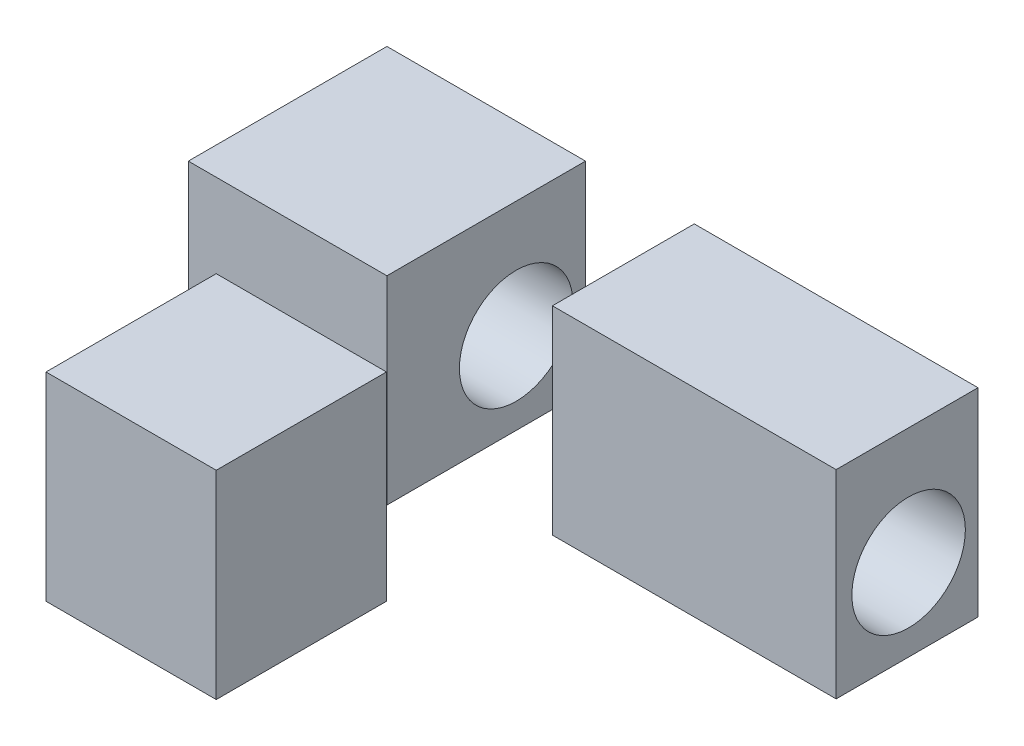
ISO-10303-21;
HEADER;
FILE_DESCRIPTION(('STEP AP214'),'2;1');
FILE_NAME('part.step','',(''),(''),'','','');
FILE_SCHEMA(('AUTOMOTIVE_DESIGN { 1 0 10303 214 1 1 1 1 }'));
ENDSEC;
DATA;
#1=APPLICATION_CONTEXT('core data for automotive mechanical design processes');
#2=APPLICATION_PROTOCOL_DEFINITION('international standard','automotive_design',2000,#1);
#3=PRODUCT_CONTEXT('',#1,'mechanical');
#4=PRODUCT('Part','Part','',(#3));
#5=PRODUCT_RELATED_PRODUCT_CATEGORY('part','',(#4));
#6=PRODUCT_DEFINITION_FORMATION('','',#4);
#7=PRODUCT_DEFINITION_CONTEXT('part definition',#1,'design');
#8=PRODUCT_DEFINITION('design','',#6,#7);
#9=PRODUCT_DEFINITION_SHAPE('','',#8);
#10=(LENGTH_UNIT() NAMED_UNIT(*) SI_UNIT(.MILLI.,.METRE.));
#11=(NAMED_UNIT(*) PLANE_ANGLE_UNIT() SI_UNIT($,.RADIAN.));
#12=(NAMED_UNIT(*) SI_UNIT($,.STERADIAN.) SOLID_ANGLE_UNIT());
#13=UNCERTAINTY_MEASURE_WITH_UNIT(LENGTH_MEASURE(1.E-05),#10,'distance_accuracy_value','');
#14=(GEOMETRIC_REPRESENTATION_CONTEXT(3) GLOBAL_UNCERTAINTY_ASSIGNED_CONTEXT((#13)) GLOBAL_UNIT_ASSIGNED_CONTEXT((#10,
#11,#12)) REPRESENTATION_CONTEXT('',''));
#15=CARTESIAN_POINT('',(0.,0.,0.));
#16=DIRECTION('',(0.,0.,1.));
#17=DIRECTION('',(1.,0.,0.));
#18=AXIS2_PLACEMENT_3D('',#15,#16,#17);
#19=CARTESIAN_POINT('',(-49.5238095238095,70.,60.2742857142857));
#20=DIRECTION('',(1.,0.,0.));
#21=DIRECTION('',(0.,0.,-1.));
#22=AXIS2_PLACEMENT_3D('',#19,#20,#21);
#23=PLANE('',#22);
#24=DIRECTION('',(0.,0.,1.));
#25=VECTOR('',#24,1.);
#26=CARTESIAN_POINT('',(-49.5238095238095,0.,60.2742857142857));
#27=LINE('',#26,#25);
#28=CARTESIAN_POINT('',(-49.5238095238095,0.,60.2742857142857));
#29=VERTEX_POINT('',#28);
#30=CARTESIAN_POINT('',(-49.5238095238095,0.,120.274285714286));
#31=VERTEX_POINT('',#30);
#32=EDGE_CURVE('E107',#29,#31,#27,.T.);
#33=ORIENTED_EDGE('',*,*,#32,.T.);
#34=DIRECTION('',(0.,-1.,0.));
#35=VECTOR('',#34,1.);
#36=CARTESIAN_POINT('',(-49.5238095238095,70.,120.274285714286));
#37=LINE('',#36,#35);
#38=CARTESIAN_POINT('',(-49.5238095238095,70.,120.274285714286));
#39=VERTEX_POINT('',#38);
#40=EDGE_CURVE('E12',#39,#31,#37,.T.);
#41=ORIENTED_EDGE('',*,*,#40,.F.);
#42=DIRECTION('',(0.,0.,1.));
#43=VECTOR('',#42,1.);
#44=CARTESIAN_POINT('',(-49.5238095238095,70.,60.2742857142857));
#45=LINE('',#44,#43);
#46=CARTESIAN_POINT('',(-49.5238095238095,70.,60.2742857142857));
#47=VERTEX_POINT('',#46);
#48=EDGE_CURVE('E95',#47,#39,#45,.T.);
#49=ORIENTED_EDGE('',*,*,#48,.F.);
#50=DIRECTION('',(0.,-1.,0.));
#51=VECTOR('',#50,1.);
#52=CARTESIAN_POINT('',(-49.5238095238095,70.,60.2742857142857));
#53=LINE('',#52,#51);
#54=EDGE_CURVE('E103',#47,#29,#53,.T.);
#55=ORIENTED_EDGE('',*,*,#54,.T.);
#56=EDGE_LOOP('',(#33,#41,#49,#55));
#57=FACE_BOUND('',#56,.T.);
#58=ADVANCED_FACE('F44',(#57),#23,.F.);
#59=CARTESIAN_POINT('',(-49.5238095238095,70.,120.274285714286));
#60=DIRECTION('',(0.,0.,-1.));
#61=DIRECTION('',(-1.,0.,0.));
#62=AXIS2_PLACEMENT_3D('',#59,#60,#61);
#63=PLANE('',#62);
#64=DIRECTION('',(1.,0.,0.));
#65=VECTOR('',#64,1.);
#66=CARTESIAN_POINT('',(-49.5238095238095,0.,120.274285714286));
#67=LINE('',#66,#65);
#68=CARTESIAN_POINT('',(10.4761904761905,0.,120.274285714286));
#69=VERTEX_POINT('',#68);
#70=EDGE_CURVE('E99',#31,#69,#67,.T.);
#71=ORIENTED_EDGE('',*,*,#70,.T.);
#72=DIRECTION('',(0.,-1.,0.));
#73=VECTOR('',#72,1.);
#74=CARTESIAN_POINT('',(10.4761904761905,70.,120.274285714286));
#75=LINE('',#74,#73);
#76=CARTESIAN_POINT('',(10.4761904761905,70.,120.274285714286));
#77=VERTEX_POINT('',#76);
#78=EDGE_CURVE('E52',#77,#69,#75,.T.);
#79=ORIENTED_EDGE('',*,*,#78,.F.);
#80=DIRECTION('',(1.,0.,0.));
#81=VECTOR('',#80,1.);
#82=CARTESIAN_POINT('',(-49.5238095238095,70.,120.274285714286));
#83=LINE('',#82,#81);
#84=EDGE_CURVE('E90',#39,#77,#83,.T.);
#85=ORIENTED_EDGE('',*,*,#84,.F.);
#86=ORIENTED_EDGE('',*,*,#40,.T.);
#87=EDGE_LOOP('',(#71,#79,#85,#86));
#88=FACE_BOUND('',#87,.T.);
#89=ADVANCED_FACE('F98',(#88),#63,.F.);
#90=CARTESIAN_POINT('',(10.4761904761905,70.,60.2742857142857));
#91=DIRECTION('',(-1.,0.,0.));
#92=DIRECTION('',(0.,0.,1.));
#93=AXIS2_PLACEMENT_3D('',#90,#91,#92);
#94=PLANE('',#93);
#95=DIRECTION('',(0.,0.,-1.));
#96=VECTOR('',#95,1.);
#97=CARTESIAN_POINT('',(10.4761904761905,0.,60.2742857142857));
#98=LINE('',#97,#96);
#99=CARTESIAN_POINT('',(10.4761904761905,0.,60.2742857142857));
#100=VERTEX_POINT('',#99);
#101=EDGE_CURVE('E77',#69,#100,#98,.T.);
#102=ORIENTED_EDGE('',*,*,#101,.T.);
#103=DIRECTION('',(0.,-1.,0.));
#104=VECTOR('',#103,1.);
#105=CARTESIAN_POINT('',(10.4761904761905,70.,60.2742857142857));
#106=LINE('',#105,#104);
#107=CARTESIAN_POINT('',(10.4761904761905,70.,60.2742857142857));
#108=VERTEX_POINT('',#107);
#109=EDGE_CURVE('E100',#108,#100,#106,.T.);
#110=ORIENTED_EDGE('',*,*,#109,.F.);
#111=DIRECTION('',(0.,0.,-1.));
#112=VECTOR('',#111,1.);
#113=CARTESIAN_POINT('',(10.4761904761905,70.,60.2742857142857));
#114=LINE('',#113,#112);
#115=EDGE_CURVE('E93',#77,#108,#114,.T.);
#116=ORIENTED_EDGE('',*,*,#115,.F.);
#117=ORIENTED_EDGE('',*,*,#78,.T.);
#118=EDGE_LOOP('',(#102,#110,#116,#117));
#119=FACE_BOUND('',#118,.T.);
#120=ADVANCED_FACE('F101',(#119),#94,.F.);
#121=CARTESIAN_POINT('',(-49.5238095238095,70.,60.2742857142857));
#122=DIRECTION('',(0.,0.,1.));
#123=DIRECTION('',(1.,0.,0.));
#124=AXIS2_PLACEMENT_3D('',#121,#122,#123);
#125=PLANE('',#124);
#126=DIRECTION('',(-1.,0.,0.));
#127=VECTOR('',#126,1.);
#128=CARTESIAN_POINT('',(-49.5238095238095,0.,60.2742857142857));
#129=LINE('',#128,#127);
#130=EDGE_CURVE('E83',#100,#29,#129,.T.);
#131=ORIENTED_EDGE('',*,*,#130,.T.);
#132=ORIENTED_EDGE('',*,*,#54,.F.);
#133=DIRECTION('',(-1.,0.,0.));
#134=VECTOR('',#133,1.);
#135=CARTESIAN_POINT('',(-49.5238095238095,70.,60.2742857142857));
#136=LINE('',#135,#134);
#137=EDGE_CURVE('E60',#108,#47,#136,.T.);
#138=ORIENTED_EDGE('',*,*,#137,.F.);
#139=ORIENTED_EDGE('',*,*,#109,.T.);
#140=EDGE_LOOP('',(#131,#132,#138,#139));
#141=FACE_BOUND('',#140,.T.);
#142=ADVANCED_FACE('F114',(#141),#125,.F.);
#143=CARTESIAN_POINT('',(0.,70.,0.));
#144=DIRECTION('',(0.,1.,0.));
#145=DIRECTION('',(0.,0.,1.));
#146=AXIS2_PLACEMENT_3D('',#143,#144,#145);
#147=PLANE('',#146);
#148=ORIENTED_EDGE('',*,*,#48,.T.);
#149=ORIENTED_EDGE('',*,*,#84,.T.);
#150=ORIENTED_EDGE('',*,*,#115,.T.);
#151=ORIENTED_EDGE('',*,*,#137,.T.);
#152=EDGE_LOOP('',(#148,#149,#150,#151));
#153=FACE_BOUND('',#152,.T.);
#154=ADVANCED_FACE('F91',(#153),#147,.T.);
#155=CARTESIAN_POINT('',(0.,0.,0.));
#156=DIRECTION('',(0.,1.,0.));
#157=DIRECTION('',(0.,0.,1.));
#158=AXIS2_PLACEMENT_3D('',#155,#156,#157);
#159=PLANE('',#158);
#160=ORIENTED_EDGE('',*,*,#32,.F.);
#161=ORIENTED_EDGE('',*,*,#130,.F.);
#162=ORIENTED_EDGE('',*,*,#101,.F.);
#163=ORIENTED_EDGE('',*,*,#70,.F.);
#164=EDGE_LOOP('',(#160,#161,#162,#163));
#165=FACE_BOUND('',#164,.T.);
#166=ADVANCED_FACE('F117',(#165),#159,.F.);
#167=CLOSED_SHELL('',(#58,#89,#120,#142,#154,#166));
#168=MANIFOLD_SOLID_BREP('B2',#167);
#169=CARTESIAN_POINT('',(19.5238095238095,70.,-39.1666666666667));
#170=DIRECTION('',(1.,0.,0.));
#171=DIRECTION('',(0.,0.,-1.));
#172=AXIS2_PLACEMENT_3D('',#169,#170,#171);
#173=PLANE('',#172);
#174=CARTESIAN_POINT('',(19.5238095238095,28.9023299440304,-14.714433962219));
#175=DIRECTION('',(1.,0.,0.));
#176=DIRECTION('',(0.,0.,-1.));
#177=AXIS2_PLACEMENT_3D('',#174,#175,#176);
#178=CIRCLE('',#177,20.);
#179=CARTESIAN_POINT('',(19.5238095238095,28.9023299440304,-34.714433962219));
#180=VERTEX_POINT('',#179);
#181=EDGE_CURVE('E243',#180,#180,#178,.T.);
#182=ORIENTED_EDGE('',*,*,#181,.T.);
#183=EDGE_LOOP('',(#182));
#184=FACE_BOUND('',#183,.T.);
#185=DIRECTION('',(0.,0.,1.));
#186=VECTOR('',#185,1.);
#187=CARTESIAN_POINT('',(19.5238095238095,0.,-39.1666666666667));
#188=LINE('',#187,#186);
#189=CARTESIAN_POINT('',(19.5238095238095,0.,-39.1666666666667));
#190=VERTEX_POINT('',#189);
#191=CARTESIAN_POINT('',(19.5238095238095,0.,10.8333333333333));
#192=VERTEX_POINT('',#191);
#193=EDGE_CURVE('E240',#190,#192,#188,.T.);
#194=ORIENTED_EDGE('',*,*,#193,.T.);
#195=DIRECTION('',(0.,-1.,0.));
#196=VECTOR('',#195,1.);
#197=CARTESIAN_POINT('',(19.5238095238095,70.,10.8333333333333));
#198=LINE('',#197,#196);
#199=CARTESIAN_POINT('',(19.5238095238095,70.,10.8333333333333));
#200=VERTEX_POINT('',#199);
#201=EDGE_CURVE('E42',#200,#192,#198,.T.);
#202=ORIENTED_EDGE('',*,*,#201,.F.);
#203=DIRECTION('',(0.,0.,1.));
#204=VECTOR('',#203,1.);
#205=CARTESIAN_POINT('',(19.5238095238095,70.,-39.1666666666667));
#206=LINE('',#205,#204);
#207=CARTESIAN_POINT('',(19.5238095238095,70.,-39.1666666666667));
#208=VERTEX_POINT('',#207);
#209=EDGE_CURVE('E228',#208,#200,#206,.T.);
#210=ORIENTED_EDGE('',*,*,#209,.F.);
#211=DIRECTION('',(0.,-1.,0.));
#212=VECTOR('',#211,1.);
#213=CARTESIAN_POINT('',(19.5238095238095,70.,-39.1666666666667));
#214=LINE('',#213,#212);
#215=EDGE_CURVE('E236',#208,#190,#214,.T.);
#216=ORIENTED_EDGE('',*,*,#215,.T.);
#217=EDGE_LOOP('',(#194,#202,#210,#216));
#218=FACE_BOUND('',#217,.T.);
#219=ADVANCED_FACE('F177',(#184,#218),#173,.F.);
#220=CARTESIAN_POINT('',(19.5238095238095,70.,10.8333333333333));
#221=DIRECTION('',(0.,0.,-1.));
#222=DIRECTION('',(-1.,0.,0.));
#223=AXIS2_PLACEMENT_3D('',#220,#221,#222);
#224=PLANE('',#223);
#225=DIRECTION('',(1.,0.,0.));
#226=VECTOR('',#225,1.);
#227=CARTESIAN_POINT('',(19.5238095238095,0.,10.8333333333333));
#228=LINE('',#227,#226);
#229=CARTESIAN_POINT('',(119.52380952381,0.,10.8333333333333));
#230=VERTEX_POINT('',#229);
#231=EDGE_CURVE('E232',#192,#230,#228,.T.);
#232=ORIENTED_EDGE('',*,*,#231,.T.);
#233=DIRECTION('',(0.,-1.,0.));
#234=VECTOR('',#233,1.);
#235=CARTESIAN_POINT('',(119.52380952381,70.,10.8333333333333));
#236=LINE('',#235,#234);
#237=CARTESIAN_POINT('',(119.52380952381,70.,10.8333333333333));
#238=VERTEX_POINT('',#237);
#239=EDGE_CURVE('E185',#238,#230,#236,.T.);
#240=ORIENTED_EDGE('',*,*,#239,.F.);
#241=DIRECTION('',(1.,0.,0.));
#242=VECTOR('',#241,1.);
#243=CARTESIAN_POINT('',(19.5238095238095,70.,10.8333333333333));
#244=LINE('',#243,#242);
#245=EDGE_CURVE('E223',#200,#238,#244,.T.);
#246=ORIENTED_EDGE('',*,*,#245,.F.);
#247=ORIENTED_EDGE('',*,*,#201,.T.);
#248=EDGE_LOOP('',(#232,#240,#246,#247));
#249=FACE_BOUND('',#248,.T.);
#250=ADVANCED_FACE('F231',(#249),#224,.F.);
#251=CARTESIAN_POINT('',(119.52380952381,70.,-39.1666666666667));
#252=DIRECTION('',(-1.,0.,0.));
#253=DIRECTION('',(0.,0.,1.));
#254=AXIS2_PLACEMENT_3D('',#251,#252,#253);
#255=PLANE('',#254);
#256=CARTESIAN_POINT('',(119.52380952381,28.9023299440304,-14.714433962219));
#257=DIRECTION('',(1.,0.,0.));
#258=DIRECTION('',(0.,0.,-1.));
#259=AXIS2_PLACEMENT_3D('',#256,#257,#258);
#260=CIRCLE('',#259,20.);
#261=CARTESIAN_POINT('',(119.52380952381,28.9023299440304,-34.714433962219));
#262=VERTEX_POINT('',#261);
#263=EDGE_CURVE('E256',#262,#262,#260,.T.);
#264=ORIENTED_EDGE('',*,*,#263,.F.);
#265=EDGE_LOOP('',(#264));
#266=FACE_BOUND('',#265,.T.);
#267=DIRECTION('',(0.,0.,-1.));
#268=VECTOR('',#267,1.);
#269=CARTESIAN_POINT('',(119.52380952381,0.,-39.1666666666667));
#270=LINE('',#269,#268);
#271=CARTESIAN_POINT('',(119.52380952381,0.,-39.1666666666667));
#272=VERTEX_POINT('',#271);
#273=EDGE_CURVE('E210',#230,#272,#270,.T.);
#274=ORIENTED_EDGE('',*,*,#273,.T.);
#275=DIRECTION('',(0.,-1.,0.));
#276=VECTOR('',#275,1.);
#277=CARTESIAN_POINT('',(119.52380952381,70.,-39.1666666666667));
#278=LINE('',#277,#276);
#279=CARTESIAN_POINT('',(119.52380952381,70.,-39.1666666666667));
#280=VERTEX_POINT('',#279);
#281=EDGE_CURVE('E233',#280,#272,#278,.T.);
#282=ORIENTED_EDGE('',*,*,#281,.F.);
#283=DIRECTION('',(0.,0.,-1.));
#284=VECTOR('',#283,1.);
#285=CARTESIAN_POINT('',(119.52380952381,70.,-39.1666666666667));
#286=LINE('',#285,#284);
#287=EDGE_CURVE('E226',#238,#280,#286,.T.);
#288=ORIENTED_EDGE('',*,*,#287,.F.);
#289=ORIENTED_EDGE('',*,*,#239,.T.);
#290=EDGE_LOOP('',(#274,#282,#288,#289));
#291=FACE_BOUND('',#290,.T.);
#292=ADVANCED_FACE('F234',(#266,#291),#255,.F.);
#293=CARTESIAN_POINT('',(19.5238095238095,70.,-39.1666666666667));
#294=DIRECTION('',(0.,0.,1.));
#295=DIRECTION('',(1.,0.,0.));
#296=AXIS2_PLACEMENT_3D('',#293,#294,#295);
#297=PLANE('',#296);
#298=DIRECTION('',(-1.,0.,0.));
#299=VECTOR('',#298,1.);
#300=CARTESIAN_POINT('',(19.5238095238095,0.,-39.1666666666667));
#301=LINE('',#300,#299);
#302=EDGE_CURVE('E216',#272,#190,#301,.T.);
#303=ORIENTED_EDGE('',*,*,#302,.T.);
#304=ORIENTED_EDGE('',*,*,#215,.F.);
#305=DIRECTION('',(-1.,0.,0.));
#306=VECTOR('',#305,1.);
#307=CARTESIAN_POINT('',(19.5238095238095,70.,-39.1666666666667));
#308=LINE('',#307,#306);
#309=EDGE_CURVE('E193',#280,#208,#308,.T.);
#310=ORIENTED_EDGE('',*,*,#309,.F.);
#311=ORIENTED_EDGE('',*,*,#281,.T.);
#312=EDGE_LOOP('',(#303,#304,#310,#311));
#313=FACE_BOUND('',#312,.T.);
#314=ADVANCED_FACE('F248',(#313),#297,.F.);
#315=CARTESIAN_POINT('',(0.,70.,0.));
#316=DIRECTION('',(0.,1.,0.));
#317=DIRECTION('',(0.,0.,1.));
#318=AXIS2_PLACEMENT_3D('',#315,#316,#317);
#319=PLANE('',#318);
#320=ORIENTED_EDGE('',*,*,#209,.T.);
#321=ORIENTED_EDGE('',*,*,#245,.T.);
#322=ORIENTED_EDGE('',*,*,#287,.T.);
#323=ORIENTED_EDGE('',*,*,#309,.T.);
#324=EDGE_LOOP('',(#320,#321,#322,#323));
#325=FACE_BOUND('',#324,.T.);
#326=ADVANCED_FACE('F224',(#325),#319,.T.);
#327=CARTESIAN_POINT('',(0.,0.,0.));
#328=DIRECTION('',(0.,1.,0.));
#329=DIRECTION('',(0.,0.,1.));
#330=AXIS2_PLACEMENT_3D('',#327,#328,#329);
#331=PLANE('',#330);
#332=ORIENTED_EDGE('',*,*,#193,.F.);
#333=ORIENTED_EDGE('',*,*,#302,.F.);
#334=ORIENTED_EDGE('',*,*,#273,.F.);
#335=ORIENTED_EDGE('',*,*,#231,.F.);
#336=EDGE_LOOP('',(#332,#333,#334,#335));
#337=FACE_BOUND('',#336,.T.);
#338=ADVANCED_FACE('F251',(#337),#331,.F.);
#339=CARTESIAN_POINT('',(-88.8095238095239,28.9023299440304,-14.714433962219));
#340=DIRECTION('',(1.,0.,0.));
#341=DIRECTION('',(0.,0.,-1.));
#342=AXIS2_PLACEMENT_3D('',#339,#340,#341);
#343=CYLINDRICAL_SURFACE('',#342,20.);
#344=ORIENTED_EDGE('',*,*,#263,.T.);
#345=EDGE_LOOP('',(#344));
#346=FACE_BOUND('',#345,.T.);
#347=ORIENTED_EDGE('',*,*,#181,.F.);
#348=EDGE_LOOP('',(#347));
#349=FACE_BOUND('',#348,.T.);
#350=ADVANCED_FACE('F260',(#346,#349),#343,.F.);
#351=CLOSED_SHELL('',(#219,#250,#292,#314,#326,#338,#350));
#352=MANIFOLD_SOLID_BREP('B6',#351);
#353=CARTESIAN_POINT('',(-88.8095238095238,70.,-39.1666666666667));
#354=DIRECTION('',(1.,0.,0.));
#355=DIRECTION('',(0.,0.,-1.));
#356=AXIS2_PLACEMENT_3D('',#353,#354,#355);
#357=PLANE('',#356);
#358=CARTESIAN_POINT('',(-88.8095238095239,28.9023299440304,-14.714433962219));
#359=DIRECTION('',(1.,0.,0.));
#360=DIRECTION('',(0.,0.,-1.));
#361=AXIS2_PLACEMENT_3D('',#358,#359,#360);
#362=CIRCLE('',#361,20.);
#363=CARTESIAN_POINT('',(-88.8095238095239,28.9023299440304,-34.714433962219));
#364=VERTEX_POINT('',#363);
#365=EDGE_CURVE('E400',#364,#364,#362,.T.);
#366=ORIENTED_EDGE('',*,*,#365,.T.);
#367=EDGE_LOOP('',(#366));
#368=FACE_BOUND('',#367,.T.);
#369=DIRECTION('',(0.,0.,1.));
#370=VECTOR('',#369,1.);
#371=CARTESIAN_POINT('',(-88.8095238095238,0.,-39.1666666666667));
#372=LINE('',#371,#370);
#373=CARTESIAN_POINT('',(-88.8095238095238,0.,-39.1666666666667));
#374=VERTEX_POINT('',#373);
#375=CARTESIAN_POINT('',(-88.8095238095238,0.,30.8333333333333));
#376=VERTEX_POINT('',#375);
#377=EDGE_CURVE('E387',#374,#376,#372,.T.);
#378=ORIENTED_EDGE('',*,*,#377,.T.);
#379=DIRECTION('',(0.,-1.,0.));
#380=VECTOR('',#379,1.);
#381=CARTESIAN_POINT('',(-88.8095238095238,70.,30.8333333333333));
#382=LINE('',#381,#380);
#383=CARTESIAN_POINT('',(-88.8095238095238,70.,30.8333333333333));
#384=VERTEX_POINT('',#383);
#385=EDGE_CURVE('E175',#384,#376,#382,.T.);
#386=ORIENTED_EDGE('',*,*,#385,.F.);
#387=DIRECTION('',(0.,0.,1.));
#388=VECTOR('',#387,1.);
#389=CARTESIAN_POINT('',(-88.8095238095238,70.,-39.1666666666667));
#390=LINE('',#389,#388);
#391=CARTESIAN_POINT('',(-88.8095238095238,70.,-39.1666666666667));
#392=VERTEX_POINT('',#391);
#393=EDGE_CURVE('E374',#392,#384,#390,.T.);
#394=ORIENTED_EDGE('',*,*,#393,.F.);
#395=DIRECTION('',(0.,-1.,0.));
#396=VECTOR('',#395,1.);
#397=CARTESIAN_POINT('',(-88.8095238095238,70.,-39.1666666666667));
#398=LINE('',#397,#396);
#399=EDGE_CURVE('E383',#392,#374,#398,.T.);
#400=ORIENTED_EDGE('',*,*,#399,.T.);
#401=EDGE_LOOP('',(#378,#386,#394,#400));
#402=FACE_BOUND('',#401,.T.);
#403=ADVANCED_FACE('F322',(#368,#402),#357,.F.);
#404=CARTESIAN_POINT('',(-88.8095238095238,70.,30.8333333333333));
#405=DIRECTION('',(0.,0.,-1.));
#406=DIRECTION('',(-1.,0.,0.));
#407=AXIS2_PLACEMENT_3D('',#404,#405,#406);
#408=PLANE('',#407);
#409=DIRECTION('',(1.,0.,0.));
#410=VECTOR('',#409,1.);
#411=CARTESIAN_POINT('',(-88.8095238095238,0.,30.8333333333333));
#412=LINE('',#411,#410);
#413=CARTESIAN_POINT('',(-18.8095238095238,0.,30.8333333333333));
#414=VERTEX_POINT('',#413);
#415=EDGE_CURVE('E378',#376,#414,#412,.T.);
#416=ORIENTED_EDGE('',*,*,#415,.T.);
#417=DIRECTION('',(0.,-1.,0.));
#418=VECTOR('',#417,1.);
#419=CARTESIAN_POINT('',(-18.8095238095238,70.,30.8333333333333));
#420=LINE('',#419,#418);
#421=CARTESIAN_POINT('',(-18.8095238095238,70.,30.8333333333333));
#422=VERTEX_POINT('',#421);
#423=EDGE_CURVE('E331',#422,#414,#420,.T.);
#424=ORIENTED_EDGE('',*,*,#423,.F.);
#425=DIRECTION('',(1.,0.,0.));
#426=VECTOR('',#425,1.);
#427=CARTESIAN_POINT('',(-88.8095238095238,70.,30.8333333333333));
#428=LINE('',#427,#426);
#429=EDGE_CURVE('E369',#384,#422,#428,.T.);
#430=ORIENTED_EDGE('',*,*,#429,.F.);
#431=ORIENTED_EDGE('',*,*,#385,.T.);
#432=EDGE_LOOP('',(#416,#424,#430,#431));
#433=FACE_BOUND('',#432,.T.);
#434=ADVANCED_FACE('F377',(#433),#408,.F.);
#435=CARTESIAN_POINT('',(-18.8095238095238,70.,-39.1666666666667));
#436=DIRECTION('',(-1.,0.,0.));
#437=DIRECTION('',(0.,0.,1.));
#438=AXIS2_PLACEMENT_3D('',#435,#436,#437);
#439=PLANE('',#438);
#440=CARTESIAN_POINT('',(-18.8095238095238,28.9023299440304,-14.714433962219));
#441=DIRECTION('',(-1.,0.,0.));
#442=DIRECTION('',(0.,0.,1.));
#443=AXIS2_PLACEMENT_3D('',#440,#441,#442);
#444=CIRCLE('',#443,20.);
#445=CARTESIAN_POINT('',(-18.8095238095238,28.9023299440304,5.28556603778102));
#446=VERTEX_POINT('',#445);
#447=EDGE_CURVE('E325',#446,#446,#444,.T.);
#448=ORIENTED_EDGE('',*,*,#447,.T.);
#449=EDGE_LOOP('',(#448));
#450=FACE_BOUND('',#449,.T.);
#451=DIRECTION('',(0.,0.,-1.));
#452=VECTOR('',#451,1.);
#453=CARTESIAN_POINT('',(-18.8095238095238,0.,-39.1666666666667));
#454=LINE('',#453,#452);
#455=CARTESIAN_POINT('',(-18.8095238095238,0.,-39.1666666666667));
#456=VERTEX_POINT('',#455);
#457=EDGE_CURVE('E356',#414,#456,#454,.T.);
#458=ORIENTED_EDGE('',*,*,#457,.T.);
#459=DIRECTION('',(0.,-1.,0.));
#460=VECTOR('',#459,1.);
#461=CARTESIAN_POINT('',(-18.8095238095238,70.,-39.1666666666667));
#462=LINE('',#461,#460);
#463=CARTESIAN_POINT('',(-18.8095238095238,70.,-39.1666666666667));
#464=VERTEX_POINT('',#463);
#465=EDGE_CURVE('E379',#464,#456,#462,.T.);
#466=ORIENTED_EDGE('',*,*,#465,.F.);
#467=DIRECTION('',(0.,0.,-1.));
#468=VECTOR('',#467,1.);
#469=CARTESIAN_POINT('',(-18.8095238095238,70.,-39.1666666666667));
#470=LINE('',#469,#468);
#471=EDGE_CURVE('E372',#422,#464,#470,.T.);
#472=ORIENTED_EDGE('',*,*,#471,.F.);
#473=ORIENTED_EDGE('',*,*,#423,.T.);
#474=EDGE_LOOP('',(#458,#466,#472,#473));
#475=FACE_BOUND('',#474,.T.);
#476=ADVANCED_FACE('F381',(#450,#475),#439,.F.);
#477=CARTESIAN_POINT('',(-88.8095238095238,70.,-39.1666666666667));
#478=DIRECTION('',(0.,0.,1.));
#479=DIRECTION('',(1.,0.,0.));
#480=AXIS2_PLACEMENT_3D('',#477,#478,#479);
#481=PLANE('',#480);
#482=DIRECTION('',(-1.,0.,0.));
#483=VECTOR('',#482,1.);
#484=CARTESIAN_POINT('',(-88.8095238095238,0.,-39.1666666666667));
#485=LINE('',#484,#483);
#486=EDGE_CURVE('E362',#456,#374,#485,.T.);
#487=ORIENTED_EDGE('',*,*,#486,.T.);
#488=ORIENTED_EDGE('',*,*,#399,.F.);
#489=DIRECTION('',(-1.,0.,0.));
#490=VECTOR('',#489,1.);
#491=CARTESIAN_POINT('',(-88.8095238095238,70.,-39.1666666666667));
#492=LINE('',#491,#490);
#493=EDGE_CURVE('E339',#464,#392,#492,.T.);
#494=ORIENTED_EDGE('',*,*,#493,.F.);
#495=ORIENTED_EDGE('',*,*,#465,.T.);
#496=EDGE_LOOP('',(#487,#488,#494,#495));
#497=FACE_BOUND('',#496,.T.);
#498=ADVANCED_FACE('F394',(#497),#481,.F.);
#499=CARTESIAN_POINT('',(0.,70.,0.));
#500=DIRECTION('',(0.,1.,0.));
#501=DIRECTION('',(0.,0.,1.));
#502=AXIS2_PLACEMENT_3D('',#499,#500,#501);
#503=PLANE('',#502);
#504=ORIENTED_EDGE('',*,*,#393,.T.);
#505=ORIENTED_EDGE('',*,*,#429,.T.);
#506=ORIENTED_EDGE('',*,*,#471,.T.);
#507=ORIENTED_EDGE('',*,*,#493,.T.);
#508=EDGE_LOOP('',(#504,#505,#506,#507));
#509=FACE_BOUND('',#508,.T.);
#510=ADVANCED_FACE('F370',(#509),#503,.T.);
#511=CARTESIAN_POINT('',(0.,0.,0.));
#512=DIRECTION('',(0.,1.,0.));
#513=DIRECTION('',(0.,0.,1.));
#514=AXIS2_PLACEMENT_3D('',#511,#512,#513);
#515=PLANE('',#514);
#516=ORIENTED_EDGE('',*,*,#377,.F.);
#517=ORIENTED_EDGE('',*,*,#486,.F.);
#518=ORIENTED_EDGE('',*,*,#457,.F.);
#519=ORIENTED_EDGE('',*,*,#415,.F.);
#520=EDGE_LOOP('',(#516,#517,#518,#519));
#521=FACE_BOUND('',#520,.T.);
#522=ADVANCED_FACE('F397',(#521),#515,.F.);
#523=CARTESIAN_POINT('',(-88.8095238095239,28.9023299440304,-14.714433962219));
#524=DIRECTION('',(1.,0.,0.));
#525=DIRECTION('',(0.,0.,-1.));
#526=AXIS2_PLACEMENT_3D('',#523,#524,#525);
#527=CYLINDRICAL_SURFACE('',#526,20.);
#528=ORIENTED_EDGE('',*,*,#365,.F.);
#529=EDGE_LOOP('',(#528));
#530=FACE_BOUND('',#529,.T.);
#531=ORIENTED_EDGE('',*,*,#447,.F.);
#532=EDGE_LOOP('',(#531));
#533=FACE_BOUND('',#532,.T.);
#534=ADVANCED_FACE('F408',(#530,#533),#527,.F.);
#535=CLOSED_SHELL('',(#403,#434,#476,#498,#510,#522,#534));
#536=MANIFOLD_SOLID_BREP('B36',#535);
#537=ADVANCED_BREP_SHAPE_REPRESENTATION('',(#18,#168,#352,#536),#14);
#538=SHAPE_DEFINITION_REPRESENTATION(#9,#537);
ENDSEC;
END-ISO-10303-21;
